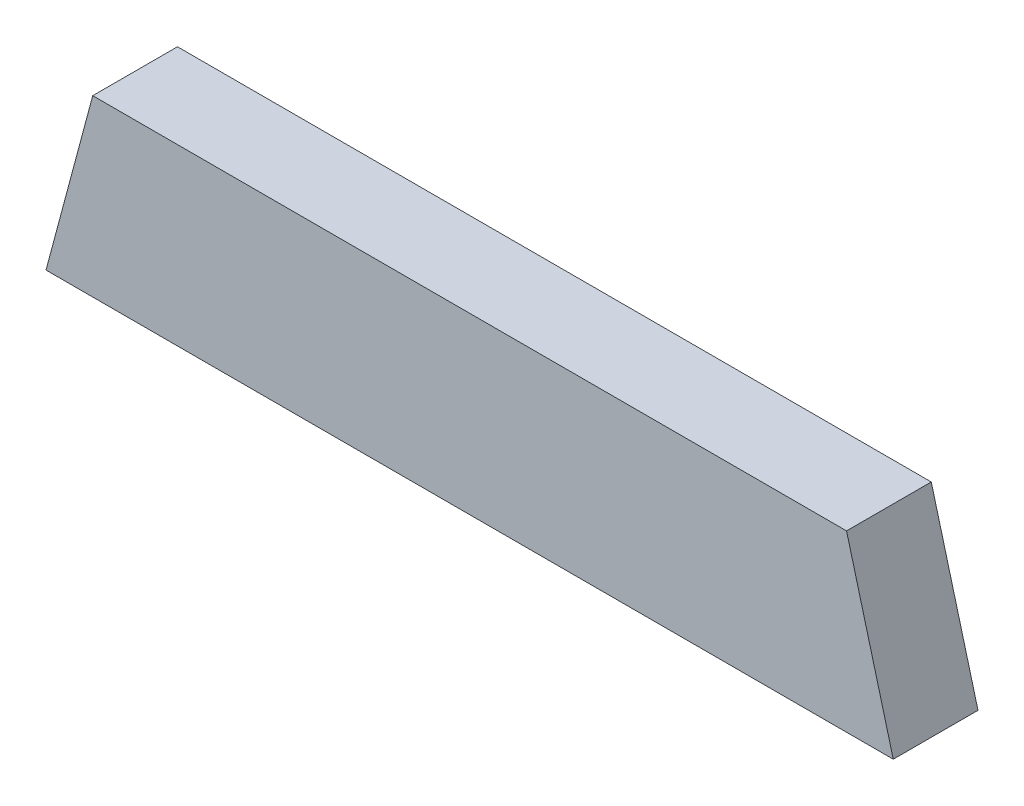
ISO-10303-21;
HEADER;
FILE_DESCRIPTION(('STEP AP214'),'2;1');
FILE_NAME('part.step','',(''),(''),'','','');
FILE_SCHEMA(('AUTOMOTIVE_DESIGN { 1 0 10303 214 1 1 1 1 }'));
ENDSEC;
DATA;
#1=APPLICATION_CONTEXT('core data for automotive mechanical design processes');
#2=APPLICATION_PROTOCOL_DEFINITION('international standard','automotive_design',2000,#1);
#3=PRODUCT_CONTEXT('',#1,'mechanical');
#4=PRODUCT('Part','Part','',(#3));
#5=PRODUCT_RELATED_PRODUCT_CATEGORY('part','',(#4));
#6=PRODUCT_DEFINITION_FORMATION('','',#4);
#7=PRODUCT_DEFINITION_CONTEXT('part definition',#1,'design');
#8=PRODUCT_DEFINITION('design','',#6,#7);
#9=PRODUCT_DEFINITION_SHAPE('','',#8);
#10=(LENGTH_UNIT() NAMED_UNIT(*) SI_UNIT(.MILLI.,.METRE.));
#11=(NAMED_UNIT(*) PLANE_ANGLE_UNIT() SI_UNIT($,.RADIAN.));
#12=(NAMED_UNIT(*) SI_UNIT($,.STERADIAN.) SOLID_ANGLE_UNIT());
#13=UNCERTAINTY_MEASURE_WITH_UNIT(LENGTH_MEASURE(1.E-05),#10,'distance_accuracy_value','');
#14=(GEOMETRIC_REPRESENTATION_CONTEXT(3) GLOBAL_UNCERTAINTY_ASSIGNED_CONTEXT((#13)) GLOBAL_UNIT_ASSIGNED_CONTEXT((#10,
#11,#12)) REPRESENTATION_CONTEXT('',''));
#15=CARTESIAN_POINT('',(0.,0.,0.));
#16=DIRECTION('',(0.,0.,1.));
#17=DIRECTION('',(1.,0.,0.));
#18=AXIS2_PLACEMENT_3D('',#15,#16,#17);
#19=CARTESIAN_POINT('',(473.970452561249,126.999999999997,50.8));
#20=DIRECTION('',(0.96592582628907,0.258819045102515,0.));
#21=DIRECTION('',(-0.258819045102515,0.96592582628907,0.));
#22=AXIS2_PLACEMENT_3D('',#19,#20,#21);
#23=PLANE('',#22);
#24=DIRECTION('',(0.258819045102515,-0.96592582628907,0.));
#25=VECTOR('',#24,1.);
#26=CARTESIAN_POINT('',(473.970452561249,126.999999999997,0.));
#27=LINE('',#26,#25);
#28=CARTESIAN_POINT('',(479.980004275784,104.572047670639,0.));
#29=VERTEX_POINT('',#28);
#30=CARTESIAN_POINT('',(508.,0.,0.));
#31=VERTEX_POINT('',#30);
#32=EDGE_CURVE('E109',#29,#31,#27,.T.);
#33=ORIENTED_EDGE('',*,*,#32,.F.);
#34=DIRECTION('',(0.,0.,-1.));
#35=VECTOR('',#34,1.);
#36=CARTESIAN_POINT('',(479.980004275784,104.572047670639,50.8));
#37=LINE('',#36,#35);
#38=CARTESIAN_POINT('',(479.980004275784,104.572047670639,50.8));
#39=VERTEX_POINT('',#38);
#40=EDGE_CURVE('E11',#39,#29,#37,.T.);
#41=ORIENTED_EDGE('',*,*,#40,.F.);
#42=DIRECTION('',(0.258819045102515,-0.96592582628907,0.));
#43=VECTOR('',#42,1.);
#44=CARTESIAN_POINT('',(473.970452561249,126.999999999997,50.8));
#45=LINE('',#44,#43);
#46=CARTESIAN_POINT('',(508.,0.,50.8));
#47=VERTEX_POINT('',#46);
#48=EDGE_CURVE('E99',#39,#47,#45,.T.);
#49=ORIENTED_EDGE('',*,*,#48,.T.);
#50=DIRECTION('',(0.,0.,-1.));
#51=VECTOR('',#50,1.);
#52=CARTESIAN_POINT('',(508.,0.,50.8));
#53=LINE('',#52,#51);
#54=EDGE_CURVE('E80',#47,#31,#53,.T.);
#55=ORIENTED_EDGE('',*,*,#54,.T.);
#56=EDGE_LOOP('',(#33,#41,#49,#55));
#57=FACE_BOUND('',#56,.T.);
#58=ADVANCED_FACE('F41',(#57),#23,.T.);
#59=CARTESIAN_POINT('',(0.,104.572047670639,50.8));
#60=DIRECTION('',(0.,1.,0.));
#61=DIRECTION('',(0.,0.,1.));
#62=AXIS2_PLACEMENT_3D('',#59,#60,#61);
#63=PLANE('',#62);
#64=DIRECTION('',(1.,0.,0.));
#65=VECTOR('',#64,1.);
#66=CARTESIAN_POINT('',(0.,104.572047670639,0.));
#67=LINE('',#66,#65);
#68=CARTESIAN_POINT('',(28.0199957242167,104.572047670639,0.));
#69=VERTEX_POINT('',#68);
#70=EDGE_CURVE('E91',#69,#29,#67,.T.);
#71=ORIENTED_EDGE('',*,*,#70,.F.);
#72=DIRECTION('',(0.,0.,-1.));
#73=VECTOR('',#72,1.);
#74=CARTESIAN_POINT('',(28.0199957242167,104.572047670639,50.8));
#75=LINE('',#74,#73);
#76=CARTESIAN_POINT('',(28.0199957242167,104.572047670639,50.8));
#77=VERTEX_POINT('',#76);
#78=EDGE_CURVE('E50',#77,#69,#75,.T.);
#79=ORIENTED_EDGE('',*,*,#78,.F.);
#80=DIRECTION('',(1.,0.,0.));
#81=VECTOR('',#80,1.);
#82=CARTESIAN_POINT('',(0.,104.572047670639,50.8));
#83=LINE('',#82,#81);
#84=EDGE_CURVE('E89',#77,#39,#83,.T.);
#85=ORIENTED_EDGE('',*,*,#84,.T.);
#86=ORIENTED_EDGE('',*,*,#40,.T.);
#87=EDGE_LOOP('',(#71,#79,#85,#86));
#88=FACE_BOUND('',#87,.T.);
#89=ADVANCED_FACE('F88',(#88),#63,.T.);
#90=CARTESIAN_POINT('',(0.,0.,50.8));
#91=DIRECTION('',(-0.965925826289068,0.258819045102521,0.));
#92=DIRECTION('',(-0.258819045102521,-0.965925826289068,0.));
#93=AXIS2_PLACEMENT_3D('',#90,#91,#92);
#94=PLANE('',#93);
#95=DIRECTION('',(0.258819045102521,0.965925826289068,0.));
#96=VECTOR('',#95,1.);
#97=CARTESIAN_POINT('',(0.,0.,0.));
#98=LINE('',#97,#96);
#99=CARTESIAN_POINT('',(0.,0.,0.));
#100=VERTEX_POINT('',#99);
#101=EDGE_CURVE('E115',#100,#69,#98,.T.);
#102=ORIENTED_EDGE('',*,*,#101,.F.);
#103=DIRECTION('',(0.,0.,-1.));
#104=VECTOR('',#103,1.);
#105=CARTESIAN_POINT('',(0.,0.,50.8));
#106=LINE('',#105,#104);
#107=CARTESIAN_POINT('',(0.,0.,50.8));
#108=VERTEX_POINT('',#107);
#109=EDGE_CURVE('E73',#108,#100,#106,.T.);
#110=ORIENTED_EDGE('',*,*,#109,.F.);
#111=DIRECTION('',(0.258819045102521,0.965925826289068,0.));
#112=VECTOR('',#111,1.);
#113=CARTESIAN_POINT('',(0.,0.,50.8));
#114=LINE('',#113,#112);
#115=EDGE_CURVE('E98',#108,#77,#114,.T.);
#116=ORIENTED_EDGE('',*,*,#115,.T.);
#117=ORIENTED_EDGE('',*,*,#78,.T.);
#118=EDGE_LOOP('',(#102,#110,#116,#117));
#119=FACE_BOUND('',#118,.T.);
#120=ADVANCED_FACE('F102',(#119),#94,.T.);
#121=CARTESIAN_POINT('',(0.,0.,50.8));
#122=DIRECTION('',(0.,1.,0.));
#123=DIRECTION('',(0.,0.,1.));
#124=AXIS2_PLACEMENT_3D('',#121,#122,#123);
#125=PLANE('',#124);
#126=DIRECTION('',(1.,0.,0.));
#127=VECTOR('',#126,1.);
#128=CARTESIAN_POINT('',(0.,0.,0.));
#129=LINE('',#128,#127);
#130=EDGE_CURVE('E118',#100,#31,#129,.T.);
#131=ORIENTED_EDGE('',*,*,#130,.T.);
#132=ORIENTED_EDGE('',*,*,#54,.F.);
#133=DIRECTION('',(1.,0.,0.));
#134=VECTOR('',#133,1.);
#135=CARTESIAN_POINT('',(0.,0.,50.8));
#136=LINE('',#135,#134);
#137=EDGE_CURVE('E58',#108,#47,#136,.T.);
#138=ORIENTED_EDGE('',*,*,#137,.F.);
#139=ORIENTED_EDGE('',*,*,#109,.T.);
#140=EDGE_LOOP('',(#131,#132,#138,#139));
#141=FACE_BOUND('',#140,.T.);
#142=ADVANCED_FACE('F132',(#141),#125,.F.);
#143=CARTESIAN_POINT('',(0.,0.,50.8));
#144=DIRECTION('',(0.,0.,1.));
#145=DIRECTION('',(1.,0.,0.));
#146=AXIS2_PLACEMENT_3D('',#143,#144,#145);
#147=PLANE('',#146);
#148=ORIENTED_EDGE('',*,*,#48,.F.);
#149=ORIENTED_EDGE('',*,*,#84,.F.);
#150=ORIENTED_EDGE('',*,*,#115,.F.);
#151=ORIENTED_EDGE('',*,*,#137,.T.);
#152=EDGE_LOOP('',(#148,#149,#150,#151));
#153=FACE_BOUND('',#152,.T.);
#154=ADVANCED_FACE('F97',(#153),#147,.T.);
#155=CARTESIAN_POINT('',(0.,0.,0.));
#156=DIRECTION('',(0.,0.,1.));
#157=DIRECTION('',(1.,0.,0.));
#158=AXIS2_PLACEMENT_3D('',#155,#156,#157);
#159=PLANE('',#158);
#160=ORIENTED_EDGE('',*,*,#32,.T.);
#161=ORIENTED_EDGE('',*,*,#130,.F.);
#162=ORIENTED_EDGE('',*,*,#101,.T.);
#163=ORIENTED_EDGE('',*,*,#70,.T.);
#164=EDGE_LOOP('',(#160,#161,#162,#163));
#165=FACE_BOUND('',#164,.T.);
#166=ADVANCED_FACE('F137',(#165),#159,.F.);
#167=CLOSED_SHELL('',(#58,#89,#120,#142,#154,#166));
#168=MANIFOLD_SOLID_BREP('B2',#167);
#169=ADVANCED_BREP_SHAPE_REPRESENTATION('',(#18,#168),#14);
#170=SHAPE_DEFINITION_REPRESENTATION(#9,#169);
ENDSEC;
END-ISO-10303-21;
